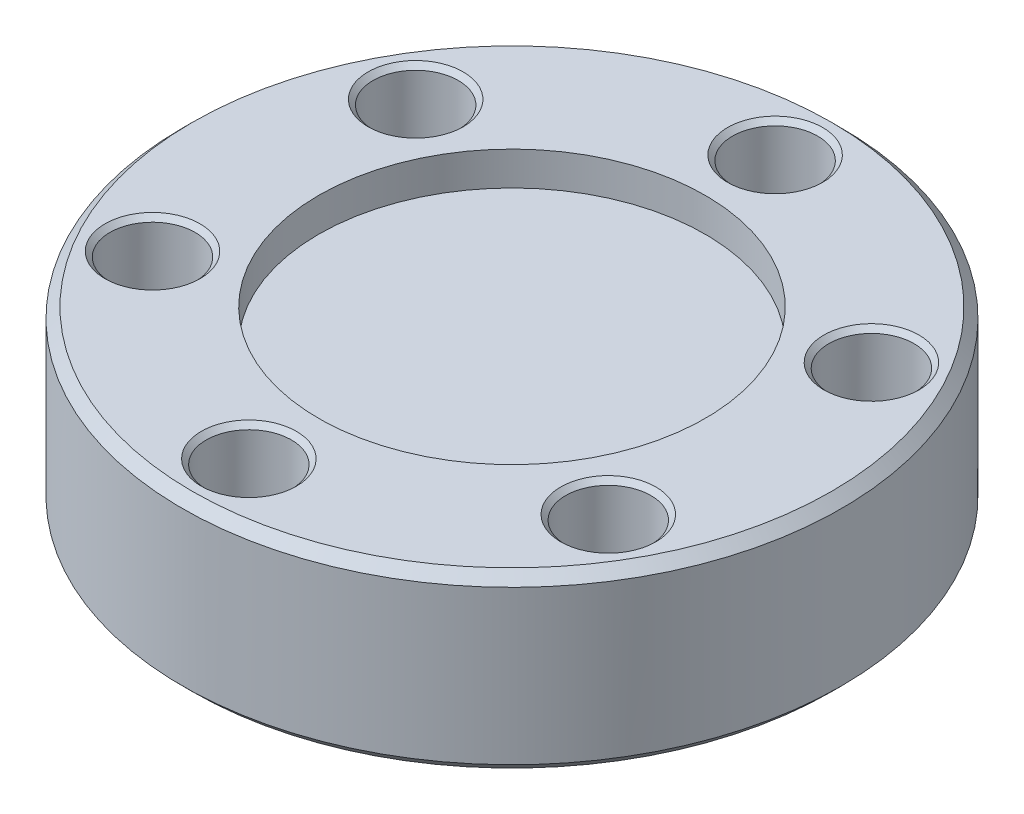
ISO-10303-21;
HEADER;
FILE_DESCRIPTION(('STEP AP214'),'2;1');
FILE_NAME('part.step','',(''),(''),'','','');
FILE_SCHEMA(('AUTOMOTIVE_DESIGN { 1 0 10303 214 1 1 1 1 }'));
ENDSEC;
DATA;
#1=APPLICATION_CONTEXT('core data for automotive mechanical design processes');
#2=APPLICATION_PROTOCOL_DEFINITION('international standard','automotive_design',2000,#1);
#3=PRODUCT_CONTEXT('',#1,'mechanical');
#4=PRODUCT('Part','Part','',(#3));
#5=PRODUCT_RELATED_PRODUCT_CATEGORY('part','',(#4));
#6=PRODUCT_DEFINITION_FORMATION('','',#4);
#7=PRODUCT_DEFINITION_CONTEXT('part definition',#1,'design');
#8=PRODUCT_DEFINITION('design','',#6,#7);
#9=PRODUCT_DEFINITION_SHAPE('','',#8);
#10=(LENGTH_UNIT() NAMED_UNIT(*) SI_UNIT(.MILLI.,.METRE.));
#11=(NAMED_UNIT(*) PLANE_ANGLE_UNIT() SI_UNIT($,.RADIAN.));
#12=(NAMED_UNIT(*) SI_UNIT($,.STERADIAN.) SOLID_ANGLE_UNIT());
#13=UNCERTAINTY_MEASURE_WITH_UNIT(LENGTH_MEASURE(1.E-05),#10,'distance_accuracy_value','');
#14=(GEOMETRIC_REPRESENTATION_CONTEXT(3) GLOBAL_UNCERTAINTY_ASSIGNED_CONTEXT((#13)) GLOBAL_UNIT_ASSIGNED_CONTEXT((#10,
#11,#12)) REPRESENTATION_CONTEXT('',''));
#15=CARTESIAN_POINT('',(0.,0.,0.));
#16=DIRECTION('',(0.,0.,1.));
#17=DIRECTION('',(1.,0.,0.));
#18=AXIS2_PLACEMENT_3D('',#15,#16,#17);
#19=CARTESIAN_POINT('',(0.,5.0038,0.));
#20=DIRECTION('',(0.,-1.,0.));
#21=DIRECTION('',(0.,0.,-1.));
#22=AXIS2_PLACEMENT_3D('',#19,#20,#21);
#23=PLANE('',#22);
#24=CARTESIAN_POINT('',(0.,5.0038,0.));
#25=DIRECTION('',(0.,-1.,0.));
#26=DIRECTION('',(0.,0.,-1.));
#27=AXIS2_PLACEMENT_3D('',#24,#25,#26);
#28=CIRCLE('',#27,9.906);
#29=CARTESIAN_POINT('',(-9.906,5.0038,0.));
#30=VERTEX_POINT('',#29);
#31=EDGE_CURVE('E329',#30,#30,#28,.T.);
#32=ORIENTED_EDGE('',*,*,#31,.T.);
#33=EDGE_LOOP('',(#32));
#34=FACE_BOUND('',#33,.T.);
#35=ADVANCED_FACE('F16',(#34),#23,.T.);
#36=CARTESIAN_POINT('',(0.379810118509473,4.4958,-9.97497173499159));
#37=DIRECTION('',(0.,1.,0.));
#38=DIRECTION('',(1.,0.,0.));
#39=AXIS2_PLACEMENT_3D('',#36,#37,#38);
#40=PLANE('',#39);
#41=CARTESIAN_POINT('',(0.,4.4958,0.));
#42=DIRECTION('',(0.,-1.,0.));
#43=DIRECTION('',(1.,0.,0.));
#44=AXIS2_PLACEMENT_3D('',#41,#42,#43);
#45=CIRCLE('',#44,8.001);
#46=CARTESIAN_POINT('',(-7.99520635247424,4.4958,-0.304427957583965));
#47=VERTEX_POINT('',#46);
#48=EDGE_CURVE('E348',#47,#47,#45,.T.);
#49=ORIENTED_EDGE('',*,*,#48,.T.);
#50=EDGE_LOOP('',(#49));
#51=FACE_BOUND('',#50,.T.);
#52=CARTESIAN_POINT('',(0.,4.4958,0.));
#53=DIRECTION('',(0.,-1.,0.));
#54=DIRECTION('',(-1.,0.,0.));
#55=AXIS2_PLACEMENT_3D('',#52,#53,#54);
#56=CIRCLE('',#55,9.906);
#57=CARTESIAN_POINT('',(-9.906,4.4958,0.));
#58=VERTEX_POINT('',#57);
#59=EDGE_CURVE('E353',#58,#58,#56,.T.);
#60=ORIENTED_EDGE('',*,*,#59,.F.);
#61=EDGE_LOOP('',(#60));
#62=FACE_BOUND('',#61,.T.);
#63=ADVANCED_FACE('F18',(#51,#62),#40,.T.);
#64=CARTESIAN_POINT('',(0.,7.1628,0.));
#65=DIRECTION('',(0.,1.,0.));
#66=DIRECTION('',(1.,0.,0.));
#67=AXIS2_PLACEMENT_3D('',#64,#65,#66);
#68=PLANE('',#67);
#69=CARTESIAN_POINT('',(0.,7.1628,0.));
#70=DIRECTION('',(0.,1.,0.));
#71=DIRECTION('',(0.,0.,1.));
#72=AXIS2_PLACEMENT_3D('',#69,#70,#71);
#73=CIRCLE('',#72,9.906);
#74=CARTESIAN_POINT('',(-9.906,7.1628,0.));
#75=VERTEX_POINT('',#74);
#76=EDGE_CURVE('E11',#75,#75,#73,.T.);
#77=ORIENTED_EDGE('',*,*,#76,.T.);
#78=EDGE_LOOP('',(#77));
#79=FACE_BOUND('',#78,.T.);
#80=ADVANCED_FACE('F509',(#79),#68,.T.);
#81=CARTESIAN_POINT('',(0.,0.,10.7188));
#82=DIRECTION('',(0.,-1.,0.));
#83=DIRECTION('',(0.,0.,-1.));
#84=AXIS2_PLACEMENT_3D('',#81,#82,#83);
#85=PLANE('',#84);
#86=CARTESIAN_POINT('',(0.,0.,0.));
#87=DIRECTION('',(0.,-1.,0.));
#88=DIRECTION('',(1.,0.,0.));
#89=AXIS2_PLACEMENT_3D('',#86,#87,#88);
#90=CIRCLE('',#89,10.7188);
#91=CARTESIAN_POINT('',(-10.7188,0.,0.));
#92=VERTEX_POINT('',#91);
#93=EDGE_CURVE('E276',#92,#92,#90,.T.);
#94=ORIENTED_EDGE('',*,*,#93,.F.);
#95=EDGE_LOOP('',(#94));
#96=FACE_BOUND('',#95,.T.);
#97=CARTESIAN_POINT('',(0.,0.,13.4874));
#98=DIRECTION('',(0.,1.,0.));
#99=DIRECTION('',(1.,0.,0.));
#100=AXIS2_PLACEMENT_3D('',#97,#98,#99);
#101=CIRCLE('',#100,2.4384);
#102=CARTESIAN_POINT('',(-2.4384,0.,13.4874));
#103=VERTEX_POINT('',#102);
#104=EDGE_CURVE('E337',#103,#103,#101,.T.);
#105=ORIENTED_EDGE('',*,*,#104,.T.);
#106=EDGE_LOOP('',(#105));
#107=FACE_BOUND('',#106,.T.);
#108=CARTESIAN_POINT('',(11.6804310310023,0.,6.7437));
#109=DIRECTION('',(0.,1.,0.));
#110=DIRECTION('',(1.,0.,0.));
#111=AXIS2_PLACEMENT_3D('',#108,#109,#110);
#112=CIRCLE('',#111,2.4384);
#113=CARTESIAN_POINT('',(9.24203103100224,0.,6.7437));
#114=VERTEX_POINT('',#113);
#115=EDGE_CURVE('E301',#114,#114,#112,.T.);
#116=ORIENTED_EDGE('',*,*,#115,.T.);
#117=EDGE_LOOP('',(#116));
#118=FACE_BOUND('',#117,.T.);
#119=CARTESIAN_POINT('',(11.6804310310022,0.,-6.7437));
#120=DIRECTION('',(0.,1.,0.));
#121=DIRECTION('',(1.,0.,0.));
#122=AXIS2_PLACEMENT_3D('',#119,#120,#121);
#123=CIRCLE('',#122,2.4384);
#124=CARTESIAN_POINT('',(9.24203103100221,0.,-6.7437));
#125=VERTEX_POINT('',#124);
#126=EDGE_CURVE('E376',#125,#125,#123,.T.);
#127=ORIENTED_EDGE('',*,*,#126,.T.);
#128=EDGE_LOOP('',(#127));
#129=FACE_BOUND('',#128,.T.);
#130=CARTESIAN_POINT('',(0.,0.,-13.4874));
#131=DIRECTION('',(0.,1.,0.));
#132=DIRECTION('',(1.,0.,0.));
#133=AXIS2_PLACEMENT_3D('',#130,#131,#132);
#134=CIRCLE('',#133,2.4384);
#135=CARTESIAN_POINT('',(-2.4384000000001,0.,-13.4874));
#136=VERTEX_POINT('',#135);
#137=EDGE_CURVE('E409',#136,#136,#134,.T.);
#138=ORIENTED_EDGE('',*,*,#137,.T.);
#139=EDGE_LOOP('',(#138));
#140=FACE_BOUND('',#139,.T.);
#141=CARTESIAN_POINT('',(-11.6804310310023,0.,-6.7436999999999));
#142=DIRECTION('',(0.,1.,0.));
#143=DIRECTION('',(1.,0.,0.));
#144=AXIS2_PLACEMENT_3D('',#141,#142,#143);
#145=CIRCLE('',#144,2.4384);
#146=CARTESIAN_POINT('',(-14.1188310310023,0.,-6.7436999999999));
#147=VERTEX_POINT('',#146);
#148=EDGE_CURVE('E289',#147,#147,#145,.T.);
#149=ORIENTED_EDGE('',*,*,#148,.T.);
#150=EDGE_LOOP('',(#149));
#151=FACE_BOUND('',#150,.T.);
#152=CARTESIAN_POINT('',(-11.6804310310022,0.,6.74370000000015));
#153=DIRECTION('',(0.,1.,0.));
#154=DIRECTION('',(1.,0.,0.));
#155=AXIS2_PLACEMENT_3D('',#152,#153,#154);
#156=CIRCLE('',#155,2.4384);
#157=CARTESIAN_POINT('',(-14.1188310310021,0.,6.74370000000015));
#158=VERTEX_POINT('',#157);
#159=EDGE_CURVE('E213',#158,#158,#156,.T.);
#160=ORIENTED_EDGE('',*,*,#159,.T.);
#161=EDGE_LOOP('',(#160));
#162=FACE_BOUND('',#161,.T.);
#163=CARTESIAN_POINT('',(0.,0.,0.));
#164=DIRECTION('',(0.,-1.,0.));
#165=DIRECTION('',(1.,0.,0.));
#166=AXIS2_PLACEMENT_3D('',#163,#164,#165);
#167=CIRCLE('',#166,16.383);
#168=CARTESIAN_POINT('',(16.383,0.,0.));
#169=VERTEX_POINT('',#168);
#170=EDGE_CURVE('E256',#169,#169,#167,.T.);
#171=ORIENTED_EDGE('',*,*,#170,.T.);
#172=EDGE_LOOP('',(#171));
#173=FACE_BOUND('',#172,.T.);
#174=ADVANCED_FACE('F499',(#96,#107,#118,#129,#140,#151,#162,#173),#85,.T.);
#175=CARTESIAN_POINT('',(0.,1.143,9.144));
#176=DIRECTION('',(0.,-1.,0.));
#177=DIRECTION('',(0.,0.,-1.));
#178=AXIS2_PLACEMENT_3D('',#175,#176,#177);
#179=PLANE('',#178);
#180=CARTESIAN_POINT('',(0.,1.143,0.));
#181=DIRECTION('',(0.,-1.,0.));
#182=DIRECTION('',(1.,0.,0.));
#183=AXIS2_PLACEMENT_3D('',#180,#181,#182);
#184=CIRCLE('',#183,8.001);
#185=CARTESIAN_POINT('',(-7.99520635247424,1.143,-0.304427957583965));
#186=VERTEX_POINT('',#185);
#187=EDGE_CURVE('E385',#186,#186,#184,.T.);
#188=ORIENTED_EDGE('',*,*,#187,.F.);
#189=EDGE_LOOP('',(#188));
#190=FACE_BOUND('',#189,.T.);
#191=CARTESIAN_POINT('',(0.,1.143,0.));
#192=DIRECTION('',(0.,-1.,0.));
#193=DIRECTION('',(1.,0.,0.));
#194=AXIS2_PLACEMENT_3D('',#191,#192,#193);
#195=CIRCLE('',#194,9.144);
#196=CARTESIAN_POINT('',(-9.144,1.143,0.));
#197=VERTEX_POINT('',#196);
#198=EDGE_CURVE('E245',#197,#197,#195,.T.);
#199=ORIENTED_EDGE('',*,*,#198,.T.);
#200=EDGE_LOOP('',(#199));
#201=FACE_BOUND('',#200,.T.);
#202=ADVANCED_FACE('F496',(#190,#201),#179,.T.);
#203=CARTESIAN_POINT('',(0.,8.89,16.891));
#204=DIRECTION('',(0.,1.,0.));
#205=DIRECTION('',(1.,0.,0.));
#206=AXIS2_PLACEMENT_3D('',#203,#204,#205);
#207=PLANE('',#206);
#208=CARTESIAN_POINT('',(0.,8.89,0.));
#209=DIRECTION('',(0.,-1.,0.));
#210=DIRECTION('',(1.,0.,0.));
#211=AXIS2_PLACEMENT_3D('',#208,#209,#210);
#212=CIRCLE('',#211,9.906);
#213=CARTESIAN_POINT('',(-9.906,8.89,0.));
#214=VERTEX_POINT('',#213);
#215=EDGE_CURVE('E263',#214,#214,#212,.T.);
#216=ORIENTED_EDGE('',*,*,#215,.T.);
#217=EDGE_LOOP('',(#216));
#218=FACE_BOUND('',#217,.T.);
#219=CARTESIAN_POINT('',(0.,8.89,13.4874));
#220=DIRECTION('',(0.,-1.,0.));
#221=DIRECTION('',(-1.,0.,0.));
#222=AXIS2_PLACEMENT_3D('',#219,#220,#221);
#223=CIRCLE('',#222,2.4384);
#224=CARTESIAN_POINT('',(2.4384,8.89,13.4874));
#225=VERTEX_POINT('',#224);
#226=EDGE_CURVE('E244',#225,#225,#223,.T.);
#227=ORIENTED_EDGE('',*,*,#226,.T.);
#228=EDGE_LOOP('',(#227));
#229=FACE_BOUND('',#228,.T.);
#230=CARTESIAN_POINT('',(11.6804310310023,8.89,6.7437));
#231=DIRECTION('',(0.,-1.,0.));
#232=DIRECTION('',(-1.,0.,0.));
#233=AXIS2_PLACEMENT_3D('',#230,#231,#232);
#234=CIRCLE('',#233,2.4384);
#235=CARTESIAN_POINT('',(14.1188310310023,8.89,6.7437));
#236=VERTEX_POINT('',#235);
#237=EDGE_CURVE('E372',#236,#236,#234,.T.);
#238=ORIENTED_EDGE('',*,*,#237,.T.);
#239=EDGE_LOOP('',(#238));
#240=FACE_BOUND('',#239,.T.);
#241=CARTESIAN_POINT('',(11.6804310310022,8.89,-6.7437));
#242=DIRECTION('',(0.,-1.,0.));
#243=DIRECTION('',(-1.,0.,0.));
#244=AXIS2_PLACEMENT_3D('',#241,#242,#243);
#245=CIRCLE('',#244,2.4384);
#246=CARTESIAN_POINT('',(14.1188310310022,8.89,-6.7437));
#247=VERTEX_POINT('',#246);
#248=EDGE_CURVE('E468',#247,#247,#245,.T.);
#249=ORIENTED_EDGE('',*,*,#248,.T.);
#250=EDGE_LOOP('',(#249));
#251=FACE_BOUND('',#250,.T.);
#252=CARTESIAN_POINT('',(0.,8.89,-13.4874));
#253=DIRECTION('',(0.,-1.,0.));
#254=DIRECTION('',(-1.,0.,0.));
#255=AXIS2_PLACEMENT_3D('',#252,#253,#254);
#256=CIRCLE('',#255,2.4384);
#257=CARTESIAN_POINT('',(2.43839999999991,8.89,-13.4874));
#258=VERTEX_POINT('',#257);
#259=EDGE_CURVE('E394',#258,#258,#256,.T.);
#260=ORIENTED_EDGE('',*,*,#259,.T.);
#261=EDGE_LOOP('',(#260));
#262=FACE_BOUND('',#261,.T.);
#263=CARTESIAN_POINT('',(-11.6804310310023,8.89,-6.7436999999999));
#264=DIRECTION('',(0.,-1.,0.));
#265=DIRECTION('',(-1.,0.,0.));
#266=AXIS2_PLACEMENT_3D('',#263,#264,#265);
#267=CIRCLE('',#266,2.4384);
#268=CARTESIAN_POINT('',(-9.24203103100229,8.89,-6.7436999999999));
#269=VERTEX_POINT('',#268);
#270=EDGE_CURVE('E290',#269,#269,#267,.T.);
#271=ORIENTED_EDGE('',*,*,#270,.T.);
#272=EDGE_LOOP('',(#271));
#273=FACE_BOUND('',#272,.T.);
#274=CARTESIAN_POINT('',(-11.6804310310022,8.89,6.74370000000015));
#275=DIRECTION('',(0.,-1.,0.));
#276=DIRECTION('',(-1.,0.,0.));
#277=AXIS2_PLACEMENT_3D('',#274,#275,#276);
#278=CIRCLE('',#277,2.4384);
#279=CARTESIAN_POINT('',(-9.24203103100214,8.89,6.74370000000015));
#280=VERTEX_POINT('',#279);
#281=EDGE_CURVE('E225',#280,#280,#278,.T.);
#282=ORIENTED_EDGE('',*,*,#281,.T.);
#283=EDGE_LOOP('',(#282));
#284=FACE_BOUND('',#283,.T.);
#285=CARTESIAN_POINT('',(0.,8.89,0.));
#286=DIRECTION('',(0.,1.,0.));
#287=DIRECTION('',(-1.,0.,0.));
#288=AXIS2_PLACEMENT_3D('',#285,#286,#287);
#289=CIRCLE('',#288,16.383);
#290=CARTESIAN_POINT('',(-16.383,8.89,0.));
#291=VERTEX_POINT('',#290);
#292=EDGE_CURVE('E237',#291,#291,#289,.T.);
#293=ORIENTED_EDGE('',*,*,#292,.T.);
#294=EDGE_LOOP('',(#293));
#295=FACE_BOUND('',#294,.T.);
#296=ADVANCED_FACE('F498',(#218,#229,#240,#251,#262,#273,#284,#295),#207,.T.);
#297=CARTESIAN_POINT('',(0.,0.,0.));
#298=DIRECTION('',(0.,-1.,0.));
#299=DIRECTION('',(1.,0.,0.));
#300=AXIS2_PLACEMENT_3D('',#297,#298,#299);
#301=CYLINDRICAL_SURFACE('',#300,9.906);
#302=ORIENTED_EDGE('',*,*,#215,.F.);
#303=DIRECTION('',(0.,-1.,0.));
#304=VECTOR('',#303,1.);
#305=CARTESIAN_POINT('',(-9.906,0.,0.));
#306=LINE('',#305,#304);
#307=EDGE_CURVE('E27',#214,#75,#306,.T.);
#308=ORIENTED_EDGE('',*,*,#307,.T.);
#309=ORIENTED_EDGE('',*,*,#76,.F.);
#310=ORIENTED_EDGE('',*,*,#307,.F.);
#311=EDGE_LOOP('',(#302,#308,#309,#310));
#312=FACE_BOUND('',#311,.T.);
#313=ADVANCED_FACE('F506',(#312),#301,.F.);
#314=CARTESIAN_POINT('',(0.,0.,0.));
#315=DIRECTION('',(0.,-1.,0.));
#316=DIRECTION('',(1.,0.,0.));
#317=AXIS2_PLACEMENT_3D('',#314,#315,#316);
#318=CYLINDRICAL_SURFACE('',#317,16.891);
#319=CARTESIAN_POINT('',(0.,0.508,0.));
#320=DIRECTION('',(0.,1.,0.));
#321=DIRECTION('',(1.,0.,0.));
#322=AXIS2_PLACEMENT_3D('',#319,#320,#321);
#323=CIRCLE('',#322,16.891);
#324=CARTESIAN_POINT('',(-16.891,0.508,0.));
#325=VERTEX_POINT('',#324);
#326=CARTESIAN_POINT('',(16.891,0.508,0.));
#327=VERTEX_POINT('',#326);
#328=EDGE_CURVE('E388',#325,#327,#323,.T.);
#329=ORIENTED_EDGE('',*,*,#328,.T.);
#330=CARTESIAN_POINT('',(0.,0.508,0.));
#331=DIRECTION('',(0.,1.,0.));
#332=DIRECTION('',(1.,0.,0.));
#333=AXIS2_PLACEMENT_3D('',#330,#331,#332);
#334=CIRCLE('',#333,16.891);
#335=EDGE_CURVE('E20',#327,#325,#334,.T.);
#336=ORIENTED_EDGE('',*,*,#335,.T.);
#337=DIRECTION('',(0.,1.,0.));
#338=VECTOR('',#337,1.);
#339=CARTESIAN_POINT('',(-16.891,0.,0.));
#340=LINE('',#339,#338);
#341=CARTESIAN_POINT('',(-16.891,8.382,0.));
#342=VERTEX_POINT('',#341);
#343=EDGE_CURVE('E260',#325,#342,#340,.T.);
#344=ORIENTED_EDGE('',*,*,#343,.T.);
#345=CARTESIAN_POINT('',(0.,8.382,0.));
#346=DIRECTION('',(0.,-1.,0.));
#347=DIRECTION('',(-1.,0.,0.));
#348=AXIS2_PLACEMENT_3D('',#345,#346,#347);
#349=CIRCLE('',#348,16.891);
#350=EDGE_CURVE('E251',#342,#342,#349,.T.);
#351=ORIENTED_EDGE('',*,*,#350,.T.);
#352=ORIENTED_EDGE('',*,*,#343,.F.);
#353=EDGE_LOOP('',(#329,#336,#344,#351,#352));
#354=FACE_BOUND('',#353,.T.);
#355=ADVANCED_FACE('F565',(#354),#318,.T.);
#356=CARTESIAN_POINT('',(0.,0.,0.));
#357=DIRECTION('',(0.,-1.,0.));
#358=DIRECTION('',(1.,0.,0.));
#359=AXIS2_PLACEMENT_3D('',#356,#357,#358);
#360=CYLINDRICAL_SURFACE('',#359,9.144);
#361=ORIENTED_EDGE('',*,*,#198,.F.);
#362=DIRECTION('',(0.,-1.,0.));
#363=VECTOR('',#362,1.);
#364=CARTESIAN_POINT('',(-9.144,0.,0.));
#365=LINE('',#364,#363);
#366=CARTESIAN_POINT('',(-9.144,0.635,0.));
#367=VERTEX_POINT('',#366);
#368=EDGE_CURVE('E249',#197,#367,#365,.T.);
#369=ORIENTED_EDGE('',*,*,#368,.T.);
#370=CARTESIAN_POINT('',(0.,0.635,0.));
#371=DIRECTION('',(0.,-1.,0.));
#372=DIRECTION('',(1.,0.,0.));
#373=AXIS2_PLACEMENT_3D('',#370,#371,#372);
#374=CIRCLE('',#373,9.144);
#375=CARTESIAN_POINT('',(9.144,0.635,0.));
#376=VERTEX_POINT('',#375);
#377=EDGE_CURVE('E336',#367,#376,#374,.T.);
#378=ORIENTED_EDGE('',*,*,#377,.T.);
#379=CARTESIAN_POINT('',(0.,0.635,0.));
#380=DIRECTION('',(0.,-1.,0.));
#381=DIRECTION('',(1.,0.,0.));
#382=AXIS2_PLACEMENT_3D('',#379,#380,#381);
#383=CIRCLE('',#382,9.144);
#384=EDGE_CURVE('E250',#376,#367,#383,.T.);
#385=ORIENTED_EDGE('',*,*,#384,.T.);
#386=ORIENTED_EDGE('',*,*,#368,.F.);
#387=EDGE_LOOP('',(#361,#369,#378,#385,#386));
#388=FACE_BOUND('',#387,.T.);
#389=ADVANCED_FACE('F492',(#388),#360,.F.);
#390=CARTESIAN_POINT('',(0.,0.635,0.));
#391=DIRECTION('',(0.,1.,0.));
#392=DIRECTION('',(-1.,0.,0.));
#393=AXIS2_PLACEMENT_3D('',#390,#391,#392);
#394=CONICAL_SURFACE('',#393,9.144,1.22173047639603);
#395=CARTESIAN_POINT('',(0.,1.20818032492242,0.));
#396=DIRECTION('',(0.,-1.,0.));
#397=DIRECTION('',(1.,0.,0.));
#398=AXIS2_PLACEMENT_3D('',#395,#396,#397);
#399=CIRCLE('',#398,10.7188);
#400=CARTESIAN_POINT('',(10.7188,1.20818032492242,0.));
#401=VERTEX_POINT('',#400);
#402=CARTESIAN_POINT('',(-10.7188,1.20818032492242,0.));
#403=VERTEX_POINT('',#402);
#404=EDGE_CURVE('E272',#401,#403,#399,.T.);
#405=ORIENTED_EDGE('',*,*,#404,.T.);
#406=CARTESIAN_POINT('',(0.,1.20818032492242,0.));
#407=DIRECTION('',(0.,-1.,0.));
#408=DIRECTION('',(1.,0.,0.));
#409=AXIS2_PLACEMENT_3D('',#406,#407,#408);
#410=CIRCLE('',#409,10.7188);
#411=EDGE_CURVE('E267',#403,#401,#410,.T.);
#412=ORIENTED_EDGE('',*,*,#411,.T.);
#413=DIRECTION('',(-0.939692620785908,-0.342020143325669,0.));
#414=VECTOR('',#413,1.);
#415=CARTESIAN_POINT('',(9.144,0.635,0.));
#416=LINE('',#415,#414);
#417=EDGE_CURVE('E283',#401,#376,#416,.T.);
#418=ORIENTED_EDGE('',*,*,#417,.T.);
#419=ORIENTED_EDGE('',*,*,#377,.F.);
#420=ORIENTED_EDGE('',*,*,#384,.F.);
#421=ORIENTED_EDGE('',*,*,#417,.F.);
#422=EDGE_LOOP('',(#405,#412,#418,#419,#420,#421));
#423=FACE_BOUND('',#422,.T.);
#424=ADVANCED_FACE('F488',(#423),#394,.T.);
#425=CARTESIAN_POINT('',(0.,0.,0.));
#426=DIRECTION('',(0.,-1.,0.));
#427=DIRECTION('',(1.,0.,0.));
#428=AXIS2_PLACEMENT_3D('',#425,#426,#427);
#429=CYLINDRICAL_SURFACE('',#428,10.7188);
#430=ORIENTED_EDGE('',*,*,#404,.F.);
#431=ORIENTED_EDGE('',*,*,#411,.F.);
#432=DIRECTION('',(0.,-1.,0.));
#433=VECTOR('',#432,1.);
#434=CARTESIAN_POINT('',(-10.7188,0.,0.));
#435=LINE('',#434,#433);
#436=EDGE_CURVE('E271',#403,#92,#435,.T.);
#437=ORIENTED_EDGE('',*,*,#436,.T.);
#438=ORIENTED_EDGE('',*,*,#93,.T.);
#439=ORIENTED_EDGE('',*,*,#436,.F.);
#440=EDGE_LOOP('',(#430,#431,#437,#438,#439));
#441=FACE_BOUND('',#440,.T.);
#442=ADVANCED_FACE('F560',(#441),#429,.F.);
#443=CARTESIAN_POINT('',(0.,0.,13.4874));
#444=DIRECTION('',(0.,1.,0.));
#445=DIRECTION('',(-1.,0.,0.));
#446=AXIS2_PLACEMENT_3D('',#443,#444,#445);
#447=CYLINDRICAL_SURFACE('',#446,2.1844);
#448=CARTESIAN_POINT('',(0.,0.254,13.4874));
#449=DIRECTION('',(0.,-1.,0.));
#450=DIRECTION('',(1.,0.,0.));
#451=AXIS2_PLACEMENT_3D('',#448,#449,#450);
#452=CIRCLE('',#451,2.1844);
#453=CARTESIAN_POINT('',(2.1844,0.254,13.4874));
#454=VERTEX_POINT('',#453);
#455=CARTESIAN_POINT('',(-2.1844,0.254,13.4874));
#456=VERTEX_POINT('',#455);
#457=EDGE_CURVE('E239',#454,#456,#452,.T.);
#458=ORIENTED_EDGE('',*,*,#457,.T.);
#459=CARTESIAN_POINT('',(0.,0.254,13.4874));
#460=DIRECTION('',(0.,-1.,0.));
#461=DIRECTION('',(1.,0.,0.));
#462=AXIS2_PLACEMENT_3D('',#459,#460,#461);
#463=CIRCLE('',#462,2.1844);
#464=EDGE_CURVE('E243',#456,#454,#463,.T.);
#465=ORIENTED_EDGE('',*,*,#464,.T.);
#466=DIRECTION('',(0.,1.,0.));
#467=VECTOR('',#466,1.);
#468=CARTESIAN_POINT('',(2.1844,0.,13.4874));
#469=LINE('',#468,#467);
#470=CARTESIAN_POINT('',(2.1844,8.636,13.4874));
#471=VERTEX_POINT('',#470);
#472=EDGE_CURVE('E341',#454,#471,#469,.T.);
#473=ORIENTED_EDGE('',*,*,#472,.T.);
#474=CARTESIAN_POINT('',(0.,8.636,13.4874));
#475=DIRECTION('',(0.,1.,0.));
#476=DIRECTION('',(-1.,0.,0.));
#477=AXIS2_PLACEMENT_3D('',#474,#475,#476);
#478=CIRCLE('',#477,2.1844);
#479=EDGE_CURVE('E457',#471,#471,#478,.T.);
#480=ORIENTED_EDGE('',*,*,#479,.T.);
#481=ORIENTED_EDGE('',*,*,#472,.F.);
#482=EDGE_LOOP('',(#458,#465,#473,#480,#481));
#483=FACE_BOUND('',#482,.T.);
#484=ADVANCED_FACE('F533',(#483),#447,.F.);
#485=CARTESIAN_POINT('',(0.,0.,13.4874));
#486=DIRECTION('',(0.,-1.,0.));
#487=DIRECTION('',(1.,0.,0.));
#488=AXIS2_PLACEMENT_3D('',#485,#486,#487);
#489=CONICAL_SURFACE('',#488,2.4384,0.785398163397449);
#490=ORIENTED_EDGE('',*,*,#457,.F.);
#491=ORIENTED_EDGE('',*,*,#464,.F.);
#492=DIRECTION('',(-0.707106781186548,-0.707106781186547,0.));
#493=VECTOR('',#492,1.);
#494=CARTESIAN_POINT('',(-2.4384,0.,13.4874));
#495=LINE('',#494,#493);
#496=EDGE_CURVE('E327',#456,#103,#495,.T.);
#497=ORIENTED_EDGE('',*,*,#496,.T.);
#498=ORIENTED_EDGE('',*,*,#104,.F.);
#499=ORIENTED_EDGE('',*,*,#496,.F.);
#500=EDGE_LOOP('',(#490,#491,#497,#498,#499));
#501=FACE_BOUND('',#500,.T.);
#502=ADVANCED_FACE('F529',(#501),#489,.F.);
#503=CARTESIAN_POINT('',(0.,8.636,13.4874));
#504=DIRECTION('',(0.,1.,0.));
#505=DIRECTION('',(-1.,0.,0.));
#506=AXIS2_PLACEMENT_3D('',#503,#504,#505);
#507=CONICAL_SURFACE('',#506,2.1844,0.78539816339746);
#508=ORIENTED_EDGE('',*,*,#479,.F.);
#509=DIRECTION('',(0.707106781186556,0.707106781186539,0.));
#510=VECTOR('',#509,1.);
#511=CARTESIAN_POINT('',(2.1844,8.636,13.4874));
#512=LINE('',#511,#510);
#513=EDGE_CURVE('E403',#471,#225,#512,.T.);
#514=ORIENTED_EDGE('',*,*,#513,.T.);
#515=ORIENTED_EDGE('',*,*,#226,.F.);
#516=ORIENTED_EDGE('',*,*,#513,.F.);
#517=EDGE_LOOP('',(#508,#514,#515,#516));
#518=FACE_BOUND('',#517,.T.);
#519=ADVANCED_FACE('F532',(#518),#507,.F.);
#520=CARTESIAN_POINT('',(11.6804310310023,0.,6.7437));
#521=DIRECTION('',(0.,1.,0.));
#522=DIRECTION('',(-1.,0.,0.));
#523=AXIS2_PLACEMENT_3D('',#520,#521,#522);
#524=CYLINDRICAL_SURFACE('',#523,2.1844);
#525=CARTESIAN_POINT('',(11.6804310310023,0.254,6.7437));
#526=DIRECTION('',(0.,-1.,0.));
#527=DIRECTION('',(1.,0.,0.));
#528=AXIS2_PLACEMENT_3D('',#525,#526,#527);
#529=CIRCLE('',#528,2.1844);
#530=CARTESIAN_POINT('',(13.8648310310023,0.254,6.7437));
#531=VERTEX_POINT('',#530);
#532=CARTESIAN_POINT('',(9.49603103100227,0.254,6.7437));
#533=VERTEX_POINT('',#532);
#534=EDGE_CURVE('E367',#531,#533,#529,.T.);
#535=ORIENTED_EDGE('',*,*,#534,.T.);
#536=CARTESIAN_POINT('',(11.6804310310023,0.254,6.7437));
#537=DIRECTION('',(0.,-1.,0.));
#538=DIRECTION('',(1.,0.,0.));
#539=AXIS2_PLACEMENT_3D('',#536,#537,#538);
#540=CIRCLE('',#539,2.1844);
#541=EDGE_CURVE('E371',#533,#531,#540,.T.);
#542=ORIENTED_EDGE('',*,*,#541,.T.);
#543=DIRECTION('',(0.,1.,0.));
#544=VECTOR('',#543,1.);
#545=CARTESIAN_POINT('',(13.8648310310023,0.,6.7437));
#546=LINE('',#545,#544);
#547=CARTESIAN_POINT('',(13.8648310310023,8.636,6.7437));
#548=VERTEX_POINT('',#547);
#549=EDGE_CURVE('E362',#531,#548,#546,.T.);
#550=ORIENTED_EDGE('',*,*,#549,.T.);
#551=CARTESIAN_POINT('',(11.6804310310023,8.636,6.7437));
#552=DIRECTION('',(0.,1.,0.));
#553=DIRECTION('',(-1.,0.,0.));
#554=AXIS2_PLACEMENT_3D('',#551,#552,#553);
#555=CIRCLE('',#554,2.1844);
#556=EDGE_CURVE('E421',#548,#548,#555,.T.);
#557=ORIENTED_EDGE('',*,*,#556,.T.);
#558=ORIENTED_EDGE('',*,*,#549,.F.);
#559=EDGE_LOOP('',(#535,#542,#550,#557,#558));
#560=FACE_BOUND('',#559,.T.);
#561=ADVANCED_FACE('F566',(#560),#524,.F.);
#562=CARTESIAN_POINT('',(11.6804310310022,0.,-6.7437));
#563=DIRECTION('',(0.,1.,0.));
#564=DIRECTION('',(-1.,0.,0.));
#565=AXIS2_PLACEMENT_3D('',#562,#563,#564);
#566=CYLINDRICAL_SURFACE('',#565,2.1844);
#567=CARTESIAN_POINT('',(11.6804310310022,0.253999999999994,-6.7437));
#568=DIRECTION('',(0.,-1.,0.));
#569=DIRECTION('',(1.,0.,0.));
#570=AXIS2_PLACEMENT_3D('',#567,#568,#569);
#571=CIRCLE('',#570,2.1844);
#572=CARTESIAN_POINT('',(13.8648310310022,0.253999999999994,-6.7437));
#573=VERTEX_POINT('',#572);
#574=CARTESIAN_POINT('',(9.49603103100221,0.253999999999994,-6.7437));
#575=VERTEX_POINT('',#574);
#576=EDGE_CURVE('E398',#573,#575,#571,.T.);
#577=ORIENTED_EDGE('',*,*,#576,.T.);
#578=CARTESIAN_POINT('',(11.6804310310022,0.253999999999994,-6.7437));
#579=DIRECTION('',(0.,-1.,0.));
#580=DIRECTION('',(1.,0.,0.));
#581=AXIS2_PLACEMENT_3D('',#578,#579,#580);
#582=CIRCLE('',#581,2.1844);
#583=EDGE_CURVE('E377',#575,#573,#582,.T.);
#584=ORIENTED_EDGE('',*,*,#583,.T.);
#585=DIRECTION('',(0.,1.,0.));
#586=VECTOR('',#585,1.);
#587=CARTESIAN_POINT('',(13.8648310310022,0.,-6.7437));
#588=LINE('',#587,#586);
#589=CARTESIAN_POINT('',(13.8648310310022,8.636,-6.7437));
#590=VERTEX_POINT('',#589);
#591=EDGE_CURVE('E359',#573,#590,#588,.T.);
#592=ORIENTED_EDGE('',*,*,#591,.T.);
#593=CARTESIAN_POINT('',(11.6804310310022,8.636,-6.7437));
#594=DIRECTION('',(0.,1.,0.));
#595=DIRECTION('',(-1.,0.,0.));
#596=AXIS2_PLACEMENT_3D('',#593,#594,#595);
#597=CIRCLE('',#596,2.1844);
#598=EDGE_CURVE('E404',#590,#590,#597,.T.);
#599=ORIENTED_EDGE('',*,*,#598,.T.);
#600=ORIENTED_EDGE('',*,*,#591,.F.);
#601=EDGE_LOOP('',(#577,#584,#592,#599,#600));
#602=FACE_BOUND('',#601,.T.);
#603=ADVANCED_FACE('F568',(#602),#566,.F.);
#604=CARTESIAN_POINT('',(0.,0.,-13.4874));
#605=DIRECTION('',(0.,1.,0.));
#606=DIRECTION('',(-1.,0.,0.));
#607=AXIS2_PLACEMENT_3D('',#604,#605,#606);
#608=CYLINDRICAL_SURFACE('',#607,2.1844);
#609=CARTESIAN_POINT('',(0.,0.254,-13.4874));
#610=DIRECTION('',(0.,-1.,0.));
#611=DIRECTION('',(1.,0.,0.));
#612=AXIS2_PLACEMENT_3D('',#609,#610,#611);
#613=CIRCLE('',#612,2.1844);
#614=CARTESIAN_POINT('',(2.18439999999991,0.254,-13.4874));
#615=VERTEX_POINT('',#614);
#616=CARTESIAN_POINT('',(-2.1844000000001,0.254,-13.4874));
#617=VERTEX_POINT('',#616);
#618=EDGE_CURVE('E389',#615,#617,#613,.T.);
#619=ORIENTED_EDGE('',*,*,#618,.T.);
#620=CARTESIAN_POINT('',(0.,0.254,-13.4874));
#621=DIRECTION('',(0.,-1.,0.));
#622=DIRECTION('',(1.,0.,0.));
#623=AXIS2_PLACEMENT_3D('',#620,#621,#622);
#624=CIRCLE('',#623,2.1844);
#625=EDGE_CURVE('E393',#617,#615,#624,.T.);
#626=ORIENTED_EDGE('',*,*,#625,.T.);
#627=DIRECTION('',(0.,1.,0.));
#628=VECTOR('',#627,1.);
#629=CARTESIAN_POINT('',(2.18439999999991,0.,-13.4874));
#630=LINE('',#629,#628);
#631=CARTESIAN_POINT('',(2.18439999999991,8.636,-13.4874));
#632=VERTEX_POINT('',#631);
#633=EDGE_CURVE('E363',#615,#632,#630,.T.);
#634=ORIENTED_EDGE('',*,*,#633,.T.);
#635=CARTESIAN_POINT('',(0.,8.636,-13.4874));
#636=DIRECTION('',(0.,1.,0.));
#637=DIRECTION('',(-1.,0.,0.));
#638=AXIS2_PLACEMENT_3D('',#635,#636,#637);
#639=CIRCLE('',#638,2.1844);
#640=EDGE_CURVE('E284',#632,#632,#639,.T.);
#641=ORIENTED_EDGE('',*,*,#640,.T.);
#642=ORIENTED_EDGE('',*,*,#633,.F.);
#643=EDGE_LOOP('',(#619,#626,#634,#641,#642));
#644=FACE_BOUND('',#643,.T.);
#645=ADVANCED_FACE('F573',(#644),#608,.F.);
#646=CARTESIAN_POINT('',(-11.6804310310023,0.,-6.7436999999999));
#647=DIRECTION('',(0.,1.,0.));
#648=DIRECTION('',(-1.,0.,0.));
#649=AXIS2_PLACEMENT_3D('',#646,#647,#648);
#650=CYLINDRICAL_SURFACE('',#649,2.1844);
#651=CARTESIAN_POINT('',(-11.6804310310023,0.253999999999987,-6.7436999999999));
#652=DIRECTION('',(0.,-1.,0.));
#653=DIRECTION('',(1.,0.,0.));
#654=AXIS2_PLACEMENT_3D('',#651,#652,#653);
#655=CIRCLE('',#654,2.1844);
#656=CARTESIAN_POINT('',(-9.49603103100229,0.253999999999987,-6.7436999999999));
#657=VERTEX_POINT('',#656);
#658=CARTESIAN_POINT('',(-13.8648310310023,0.253999999999988,-6.7436999999999));
#659=VERTEX_POINT('',#658);
#660=EDGE_CURVE('E293',#657,#659,#655,.T.);
#661=ORIENTED_EDGE('',*,*,#660,.T.);
#662=CARTESIAN_POINT('',(-11.6804310310023,0.253999999999987,-6.7436999999999));
#663=DIRECTION('',(0.,-1.,0.));
#664=DIRECTION('',(1.,0.,0.));
#665=AXIS2_PLACEMENT_3D('',#662,#663,#664);
#666=CIRCLE('',#665,2.1844);
#667=EDGE_CURVE('E304',#659,#657,#666,.T.);
#668=ORIENTED_EDGE('',*,*,#667,.T.);
#669=DIRECTION('',(0.,1.,0.));
#670=VECTOR('',#669,1.);
#671=CARTESIAN_POINT('',(-9.49603103100229,0.,-6.7436999999999));
#672=LINE('',#671,#670);
#673=CARTESIAN_POINT('',(-9.49603103100229,8.636,-6.7436999999999));
#674=VERTEX_POINT('',#673);
#675=EDGE_CURVE('E300',#657,#674,#672,.T.);
#676=ORIENTED_EDGE('',*,*,#675,.T.);
#677=CARTESIAN_POINT('',(-11.6804310310023,8.636,-6.7436999999999));
#678=DIRECTION('',(0.,1.,0.));
#679=DIRECTION('',(-1.,0.,0.));
#680=AXIS2_PLACEMENT_3D('',#677,#678,#679);
#681=CIRCLE('',#680,2.1844);
#682=EDGE_CURVE('E297',#674,#674,#681,.T.);
#683=ORIENTED_EDGE('',*,*,#682,.T.);
#684=ORIENTED_EDGE('',*,*,#675,.F.);
#685=EDGE_LOOP('',(#661,#668,#676,#683,#684));
#686=FACE_BOUND('',#685,.T.);
#687=ADVANCED_FACE('F553',(#686),#650,.F.);
#688=CARTESIAN_POINT('',(-11.6804310310022,0.,6.74370000000015));
#689=DIRECTION('',(0.,1.,0.));
#690=DIRECTION('',(-1.,0.,0.));
#691=AXIS2_PLACEMENT_3D('',#688,#689,#690);
#692=CYLINDRICAL_SURFACE('',#691,2.1844);
#693=CARTESIAN_POINT('',(-11.6804310310022,0.253999999999994,6.74370000000015));
#694=DIRECTION('',(0.,-1.,0.));
#695=DIRECTION('',(1.,0.,0.));
#696=AXIS2_PLACEMENT_3D('',#693,#694,#695);
#697=CIRCLE('',#696,2.1844);
#698=CARTESIAN_POINT('',(-9.49603103100216,0.253999999999994,6.74370000000015));
#699=VERTEX_POINT('',#698);
#700=CARTESIAN_POINT('',(-13.8648310310022,0.253999999999993,6.74370000000015));
#701=VERTEX_POINT('',#700);
#702=EDGE_CURVE('E212',#699,#701,#697,.T.);
#703=ORIENTED_EDGE('',*,*,#702,.T.);
#704=CARTESIAN_POINT('',(-11.6804310310022,0.253999999999994,6.74370000000015));
#705=DIRECTION('',(0.,-1.,0.));
#706=DIRECTION('',(1.,0.,0.));
#707=AXIS2_PLACEMENT_3D('',#704,#705,#706);
#708=CIRCLE('',#707,2.1844);
#709=EDGE_CURVE('E215',#701,#699,#708,.T.);
#710=ORIENTED_EDGE('',*,*,#709,.T.);
#711=DIRECTION('',(0.,1.,0.));
#712=VECTOR('',#711,1.);
#713=CARTESIAN_POINT('',(-9.49603103100216,0.,6.74370000000015));
#714=LINE('',#713,#712);
#715=CARTESIAN_POINT('',(-9.49603103100216,8.636,6.74370000000015));
#716=VERTEX_POINT('',#715);
#717=EDGE_CURVE('E223',#699,#716,#714,.T.);
#718=ORIENTED_EDGE('',*,*,#717,.T.);
#719=CARTESIAN_POINT('',(-11.6804310310022,8.636,6.74370000000015));
#720=DIRECTION('',(0.,1.,0.));
#721=DIRECTION('',(-1.,0.,0.));
#722=AXIS2_PLACEMENT_3D('',#719,#720,#721);
#723=CIRCLE('',#722,2.1844);
#724=EDGE_CURVE('E277',#716,#716,#723,.T.);
#725=ORIENTED_EDGE('',*,*,#724,.T.);
#726=ORIENTED_EDGE('',*,*,#717,.F.);
#727=EDGE_LOOP('',(#703,#710,#718,#725,#726));
#728=FACE_BOUND('',#727,.T.);
#729=ADVANCED_FACE('F221',(#728),#692,.F.);
#730=CARTESIAN_POINT('',(11.6804310310023,0.,6.7437));
#731=DIRECTION('',(0.,-1.,0.));
#732=DIRECTION('',(1.,0.,0.));
#733=AXIS2_PLACEMENT_3D('',#730,#731,#732);
#734=CONICAL_SURFACE('',#733,2.4384,0.785398163397448);
#735=ORIENTED_EDGE('',*,*,#534,.F.);
#736=ORIENTED_EDGE('',*,*,#541,.F.);
#737=DIRECTION('',(-0.707106781186548,-0.707106781186548,0.));
#738=VECTOR('',#737,1.);
#739=CARTESIAN_POINT('',(9.24203103100224,0.,6.7437));
#740=LINE('',#739,#738);
#741=EDGE_CURVE('E344',#533,#114,#740,.T.);
#742=ORIENTED_EDGE('',*,*,#741,.T.);
#743=ORIENTED_EDGE('',*,*,#115,.F.);
#744=ORIENTED_EDGE('',*,*,#741,.F.);
#745=EDGE_LOOP('',(#735,#736,#742,#743,#744));
#746=FACE_BOUND('',#745,.T.);
#747=ADVANCED_FACE('F535',(#746),#734,.F.);
#748=CARTESIAN_POINT('',(11.6804310310023,8.636,6.7437));
#749=DIRECTION('',(0.,1.,0.));
#750=DIRECTION('',(-1.,0.,0.));
#751=AXIS2_PLACEMENT_3D('',#748,#749,#750);
#752=CONICAL_SURFACE('',#751,2.1844,0.785398163397437);
#753=ORIENTED_EDGE('',*,*,#556,.F.);
#754=DIRECTION('',(0.70710678118654,0.707106781186555,0.));
#755=VECTOR('',#754,1.);
#756=CARTESIAN_POINT('',(13.8648310310023,8.636,6.7437));
#757=LINE('',#756,#755);
#758=EDGE_CURVE('E417',#548,#236,#757,.T.);
#759=ORIENTED_EDGE('',*,*,#758,.T.);
#760=ORIENTED_EDGE('',*,*,#237,.F.);
#761=ORIENTED_EDGE('',*,*,#758,.F.);
#762=EDGE_LOOP('',(#753,#759,#760,#761));
#763=FACE_BOUND('',#762,.T.);
#764=ADVANCED_FACE('F538',(#763),#752,.F.);
#765=CARTESIAN_POINT('',(11.6804310310022,0.,-6.7437));
#766=DIRECTION('',(0.,-1.,0.));
#767=DIRECTION('',(1.,0.,0.));
#768=AXIS2_PLACEMENT_3D('',#765,#766,#767);
#769=CONICAL_SURFACE('',#768,2.4384,0.785398163397443);
#770=ORIENTED_EDGE('',*,*,#576,.F.);
#771=ORIENTED_EDGE('',*,*,#583,.F.);
#772=DIRECTION('',(-0.707106781186544,-0.707106781186551,0.));
#773=VECTOR('',#772,1.);
#774=CARTESIAN_POINT('',(9.24203103100221,0.,-6.7437));
#775=LINE('',#774,#773);
#776=EDGE_CURVE('E373',#575,#125,#775,.T.);
#777=ORIENTED_EDGE('',*,*,#776,.T.);
#778=ORIENTED_EDGE('',*,*,#126,.F.);
#779=ORIENTED_EDGE('',*,*,#776,.F.);
#780=EDGE_LOOP('',(#770,#771,#777,#778,#779));
#781=FACE_BOUND('',#780,.T.);
#782=ADVANCED_FACE('F558',(#781),#769,.F.);
#783=CARTESIAN_POINT('',(11.6804310310022,8.636,-6.7437));
#784=DIRECTION('',(0.,1.,0.));
#785=DIRECTION('',(-1.,0.,0.));
#786=AXIS2_PLACEMENT_3D('',#783,#784,#785);
#787=CONICAL_SURFACE('',#786,2.1844,0.785398163397456);
#788=ORIENTED_EDGE('',*,*,#598,.F.);
#789=DIRECTION('',(0.707106781186553,0.707106781186542,0.));
#790=VECTOR('',#789,1.);
#791=CARTESIAN_POINT('',(13.8648310310022,8.636,-6.7437));
#792=LINE('',#791,#790);
#793=EDGE_CURVE('E408',#590,#247,#792,.T.);
#794=ORIENTED_EDGE('',*,*,#793,.T.);
#795=ORIENTED_EDGE('',*,*,#248,.F.);
#796=ORIENTED_EDGE('',*,*,#793,.F.);
#797=EDGE_LOOP('',(#788,#794,#795,#796));
#798=FACE_BOUND('',#797,.T.);
#799=ADVANCED_FACE('F549',(#798),#787,.F.);
#800=CARTESIAN_POINT('',(0.,0.,-13.4874));
#801=DIRECTION('',(0.,-1.,0.));
#802=DIRECTION('',(1.,0.,0.));
#803=AXIS2_PLACEMENT_3D('',#800,#801,#802);
#804=CONICAL_SURFACE('',#803,2.4384,0.785398163397449);
#805=ORIENTED_EDGE('',*,*,#618,.F.);
#806=ORIENTED_EDGE('',*,*,#625,.F.);
#807=DIRECTION('',(-0.707106781186548,-0.707106781186547,0.));
#808=VECTOR('',#807,1.);
#809=CARTESIAN_POINT('',(-2.43840000000009,0.,-13.4874));
#810=LINE('',#809,#808);
#811=EDGE_CURVE('E410',#617,#136,#810,.T.);
#812=ORIENTED_EDGE('',*,*,#811,.T.);
#813=ORIENTED_EDGE('',*,*,#137,.F.);
#814=ORIENTED_EDGE('',*,*,#811,.F.);
#815=EDGE_LOOP('',(#805,#806,#812,#813,#814));
#816=FACE_BOUND('',#815,.T.);
#817=ADVANCED_FACE('F545',(#816),#804,.F.);
#818=CARTESIAN_POINT('',(0.,8.636,-13.4874));
#819=DIRECTION('',(0.,1.,0.));
#820=DIRECTION('',(-1.,0.,0.));
#821=AXIS2_PLACEMENT_3D('',#818,#819,#820);
#822=CONICAL_SURFACE('',#821,2.1844,0.78539816339746);
#823=ORIENTED_EDGE('',*,*,#640,.F.);
#824=DIRECTION('',(0.707106781186556,0.707106781186539,0.));
#825=VECTOR('',#824,1.);
#826=CARTESIAN_POINT('',(2.18439999999991,8.636,-13.4874));
#827=LINE('',#826,#825);
#828=EDGE_CURVE('E288',#632,#258,#827,.T.);
#829=ORIENTED_EDGE('',*,*,#828,.T.);
#830=ORIENTED_EDGE('',*,*,#259,.F.);
#831=ORIENTED_EDGE('',*,*,#828,.F.);
#832=EDGE_LOOP('',(#823,#829,#830,#831));
#833=FACE_BOUND('',#832,.T.);
#834=ADVANCED_FACE('F548',(#833),#822,.F.);
#835=CARTESIAN_POINT('',(-11.6804310310023,0.,-6.7436999999999));
#836=DIRECTION('',(0.,-1.,0.));
#837=DIRECTION('',(1.,0.,0.));
#838=AXIS2_PLACEMENT_3D('',#835,#836,#837);
#839=CONICAL_SURFACE('',#838,2.4384,0.785398163397447);
#840=ORIENTED_EDGE('',*,*,#660,.F.);
#841=ORIENTED_EDGE('',*,*,#667,.F.);
#842=DIRECTION('',(-0.707106781186546,-0.707106781186549,0.));
#843=VECTOR('',#842,1.);
#844=CARTESIAN_POINT('',(-14.1188310310023,0.,-6.7436999999999));
#845=LINE('',#844,#843);
#846=EDGE_CURVE('E305',#659,#147,#845,.T.);
#847=ORIENTED_EDGE('',*,*,#846,.T.);
#848=ORIENTED_EDGE('',*,*,#148,.F.);
#849=ORIENTED_EDGE('',*,*,#846,.F.);
#850=EDGE_LOOP('',(#840,#841,#847,#848,#849));
#851=FACE_BOUND('',#850,.T.);
#852=ADVANCED_FACE('F543',(#851),#839,.F.);
#853=CARTESIAN_POINT('',(-11.6804310310023,8.636,-6.7436999999999));
#854=DIRECTION('',(0.,1.,0.));
#855=DIRECTION('',(-1.,0.,0.));
#856=AXIS2_PLACEMENT_3D('',#853,#854,#855);
#857=CONICAL_SURFACE('',#856,2.1844,0.785398163397447);
#858=ORIENTED_EDGE('',*,*,#682,.F.);
#859=DIRECTION('',(0.707106781186546,0.707106781186549,0.));
#860=VECTOR('',#859,1.);
#861=CARTESIAN_POINT('',(-9.49603103100229,8.636,-6.7436999999999));
#862=LINE('',#861,#860);
#863=EDGE_CURVE('E294',#674,#269,#862,.T.);
#864=ORIENTED_EDGE('',*,*,#863,.T.);
#865=ORIENTED_EDGE('',*,*,#270,.F.);
#866=ORIENTED_EDGE('',*,*,#863,.F.);
#867=EDGE_LOOP('',(#858,#864,#865,#866));
#868=FACE_BOUND('',#867,.T.);
#869=ADVANCED_FACE('F540',(#868),#857,.F.);
#870=CARTESIAN_POINT('',(-11.6804310310022,0.,6.74370000000015));
#871=DIRECTION('',(0.,-1.,0.));
#872=DIRECTION('',(1.,0.,0.));
#873=AXIS2_PLACEMENT_3D('',#870,#871,#872);
#874=CONICAL_SURFACE('',#873,2.4384,0.785398163397445);
#875=ORIENTED_EDGE('',*,*,#702,.F.);
#876=ORIENTED_EDGE('',*,*,#709,.F.);
#877=DIRECTION('',(-0.707106781186545,-0.70710678118655,0.));
#878=VECTOR('',#877,1.);
#879=CARTESIAN_POINT('',(-14.1188310310021,0.,6.74370000000015));
#880=LINE('',#879,#878);
#881=EDGE_CURVE('E208',#701,#158,#880,.T.);
#882=ORIENTED_EDGE('',*,*,#881,.T.);
#883=ORIENTED_EDGE('',*,*,#159,.F.);
#884=ORIENTED_EDGE('',*,*,#881,.F.);
#885=EDGE_LOOP('',(#875,#876,#882,#883,#884));
#886=FACE_BOUND('',#885,.T.);
#887=ADVANCED_FACE('F210',(#886),#874,.F.);
#888=CARTESIAN_POINT('',(-11.6804310310022,8.636,6.74370000000015));
#889=DIRECTION('',(0.,1.,0.));
#890=DIRECTION('',(-1.,0.,0.));
#891=AXIS2_PLACEMENT_3D('',#888,#889,#890);
#892=CONICAL_SURFACE('',#891,2.1844,0.785398163397442);
#893=ORIENTED_EDGE('',*,*,#724,.F.);
#894=DIRECTION('',(0.707106781186543,0.707106781186552,0.));
#895=VECTOR('',#894,1.);
#896=CARTESIAN_POINT('',(-9.49603103100216,8.636,6.74370000000015));
#897=LINE('',#896,#895);
#898=EDGE_CURVE('E233',#716,#280,#897,.T.);
#899=ORIENTED_EDGE('',*,*,#898,.T.);
#900=ORIENTED_EDGE('',*,*,#281,.F.);
#901=ORIENTED_EDGE('',*,*,#898,.F.);
#902=EDGE_LOOP('',(#893,#899,#900,#901));
#903=FACE_BOUND('',#902,.T.);
#904=ADVANCED_FACE('F942',(#903),#892,.F.);
#905=CARTESIAN_POINT('',(0.,8.382,0.));
#906=DIRECTION('',(0.,-1.,0.));
#907=DIRECTION('',(1.,0.,0.));
#908=AXIS2_PLACEMENT_3D('',#905,#906,#907);
#909=CONICAL_SURFACE('',#908,16.891,0.785398163397452);
#910=ORIENTED_EDGE('',*,*,#350,.F.);
#911=DIRECTION('',(0.70710678118655,0.707106781186545,0.));
#912=VECTOR('',#911,1.);
#913=CARTESIAN_POINT('',(-16.891,8.382,0.));
#914=LINE('',#913,#912);
#915=EDGE_CURVE('E255',#342,#291,#914,.T.);
#916=ORIENTED_EDGE('',*,*,#915,.T.);
#917=ORIENTED_EDGE('',*,*,#292,.F.);
#918=ORIENTED_EDGE('',*,*,#915,.F.);
#919=EDGE_LOOP('',(#910,#916,#917,#918));
#920=FACE_BOUND('',#919,.T.);
#921=ADVANCED_FACE('F600',(#920),#909,.T.);
#922=CARTESIAN_POINT('',(0.,0.,0.));
#923=DIRECTION('',(0.,1.,0.));
#924=DIRECTION('',(-1.,0.,0.));
#925=AXIS2_PLACEMENT_3D('',#922,#923,#924);
#926=CONICAL_SURFACE('',#925,16.383,0.785398163397438);
#927=ORIENTED_EDGE('',*,*,#328,.F.);
#928=ORIENTED_EDGE('',*,*,#335,.F.);
#929=DIRECTION('',(-0.70710678118654,-0.707106781186555,0.));
#930=VECTOR('',#929,1.);
#931=CARTESIAN_POINT('',(16.383,0.,0.));
#932=LINE('',#931,#930);
#933=EDGE_CURVE('E434',#327,#169,#932,.T.);
#934=ORIENTED_EDGE('',*,*,#933,.T.);
#935=ORIENTED_EDGE('',*,*,#170,.F.);
#936=ORIENTED_EDGE('',*,*,#933,.F.);
#937=EDGE_LOOP('',(#927,#928,#934,#935,#936));
#938=FACE_BOUND('',#937,.T.);
#939=ADVANCED_FACE('F527',(#938),#926,.T.);
#940=CARTESIAN_POINT('',(0.,1.651,0.));
#941=DIRECTION('',(0.,-1.,0.));
#942=DIRECTION('',(0.999275884573683,0.,0.038048738605669));
#943=AXIS2_PLACEMENT_3D('',#940,#941,#942);
#944=CYLINDRICAL_SURFACE('',#943,8.00100000000018);
#945=ORIENTED_EDGE('',*,*,#48,.F.);
#946=DIRECTION('',(0.,-1.,0.));
#947=VECTOR('',#946,1.);
#948=CARTESIAN_POINT('',(-7.99520635247424,1.651,-0.304427957583965));
#949=LINE('',#948,#947);
#950=EDGE_CURVE('E352',#47,#186,#949,.T.);
#951=ORIENTED_EDGE('',*,*,#950,.T.);
#952=ORIENTED_EDGE('',*,*,#187,.T.);
#953=ORIENTED_EDGE('',*,*,#950,.F.);
#954=EDGE_LOOP('',(#945,#951,#952,#953));
#955=FACE_BOUND('',#954,.T.);
#956=ADVANCED_FACE('F523',(#955),#944,.F.);
#957=CARTESIAN_POINT('',(0.,0.,0.));
#958=DIRECTION('',(0.,-1.,0.));
#959=DIRECTION('',(1.,0.,0.));
#960=AXIS2_PLACEMENT_3D('',#957,#958,#959);
#961=CYLINDRICAL_SURFACE('',#960,9.906);
#962=ORIENTED_EDGE('',*,*,#31,.F.);
#963=DIRECTION('',(0.,-1.,0.));
#964=VECTOR('',#963,1.);
#965=CARTESIAN_POINT('',(-9.906,0.,0.));
#966=LINE('',#965,#964);
#967=EDGE_CURVE('E333',#30,#58,#966,.T.);
#968=ORIENTED_EDGE('',*,*,#967,.T.);
#969=ORIENTED_EDGE('',*,*,#59,.T.);
#970=ORIENTED_EDGE('',*,*,#967,.F.);
#971=EDGE_LOOP('',(#962,#968,#969,#970));
#972=FACE_BOUND('',#971,.T.);
#973=ADVANCED_FACE('F526',(#972),#961,.F.);
#974=CLOSED_SHELL('',(#35,#63,#80,#174,#202,#296,#313,#355,#389,#424,#442,#484,#502,#519,#561,
#603,#645,#687,#729,#747,#764,#782,#799,#817,#834,#852,#869,#887,#904,#921,#939,#956,#973));
#975=MANIFOLD_SOLID_BREP('B1',#974);
#976=ADVANCED_BREP_SHAPE_REPRESENTATION('',(#18,#975),#14);
#977=SHAPE_DEFINITION_REPRESENTATION(#9,#976);
ENDSEC;
END-ISO-10303-21;
